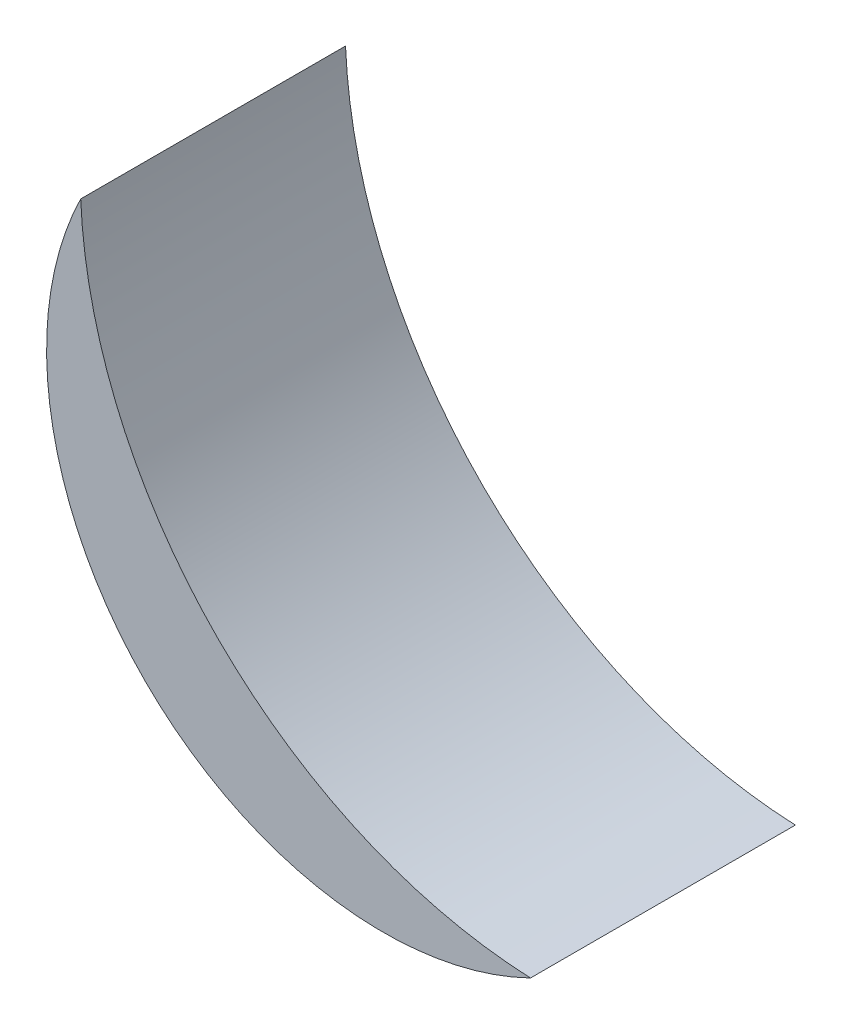
ISO-10303-21;
HEADER;
FILE_DESCRIPTION(('STEP AP214'),'2;1');
FILE_NAME('part.step','',(''),(''),'','','');
FILE_SCHEMA(('AUTOMOTIVE_DESIGN { 1 0 10303 214 1 1 1 1 }'));
ENDSEC;
DATA;
#1=APPLICATION_CONTEXT('core data for automotive mechanical design processes');
#2=APPLICATION_PROTOCOL_DEFINITION('international standard','automotive_design',2000,#1);
#3=PRODUCT_CONTEXT('',#1,'mechanical');
#4=PRODUCT('Part','Part','',(#3));
#5=PRODUCT_RELATED_PRODUCT_CATEGORY('part','',(#4));
#6=PRODUCT_DEFINITION_FORMATION('','',#4);
#7=PRODUCT_DEFINITION_CONTEXT('part definition',#1,'design');
#8=PRODUCT_DEFINITION('design','',#6,#7);
#9=PRODUCT_DEFINITION_SHAPE('','',#8);
#10=(LENGTH_UNIT() NAMED_UNIT(*) SI_UNIT(.MILLI.,.METRE.));
#11=(NAMED_UNIT(*) PLANE_ANGLE_UNIT() SI_UNIT($,.RADIAN.));
#12=(NAMED_UNIT(*) SI_UNIT($,.STERADIAN.) SOLID_ANGLE_UNIT());
#13=UNCERTAINTY_MEASURE_WITH_UNIT(LENGTH_MEASURE(1.E-05),#10,'distance_accuracy_value','');
#14=(GEOMETRIC_REPRESENTATION_CONTEXT(3) GLOBAL_UNCERTAINTY_ASSIGNED_CONTEXT((#13)) GLOBAL_UNIT_ASSIGNED_CONTEXT((#10,
#11,#12)) REPRESENTATION_CONTEXT('',''));
#15=CARTESIAN_POINT('',(0.,0.,0.));
#16=DIRECTION('',(0.,0.,1.));
#17=DIRECTION('',(1.,0.,0.));
#18=AXIS2_PLACEMENT_3D('',#15,#16,#17);
#19=CARTESIAN_POINT('',(136.398,111.633,0.));
#20=DIRECTION('',(0.,0.,-1.));
#21=DIRECTION('',(1.,0.,0.));
#22=AXIS2_PLACEMENT_3D('',#19,#20,#21);
#23=CYLINDRICAL_SURFACE('',#22,0.3556);
#24=DIRECTION('',(0.,0.,1.));
#25=VECTOR('',#24,1.);
#26=CARTESIAN_POINT('',(136.042741649054,111.617415902869,0.));
#27=LINE('',#26,#25);
#28=CARTESIAN_POINT('',(136.042741649054,111.617415902869,0.));
#29=VERTEX_POINT('',#28);
#30=CARTESIAN_POINT('',(136.042741649054,111.617415902869,0.1999996));
#31=VERTEX_POINT('',#30);
#32=EDGE_CURVE('E11',#29,#31,#27,.T.);
#33=ORIENTED_EDGE('',*,*,#32,.T.);
#34=CARTESIAN_POINT('',(136.398,111.633,0.1999996));
#35=DIRECTION('',(0.,0.,1.));
#36=DIRECTION('',(1.,0.,0.));
#37=AXIS2_PLACEMENT_3D('',#34,#35,#36);
#38=CIRCLE('',#37,0.3556);
#39=CARTESIAN_POINT('',(136.382415902869,111.277741649054,0.1999996));
#40=VERTEX_POINT('',#39);
#41=EDGE_CURVE('E24',#31,#40,#38,.T.);
#42=ORIENTED_EDGE('',*,*,#41,.T.);
#43=DIRECTION('',(0.,0.,1.));
#44=VECTOR('',#43,1.);
#45=CARTESIAN_POINT('',(136.382415902869,111.277741649054,0.));
#46=LINE('',#45,#44);
#47=CARTESIAN_POINT('',(136.382415902869,111.277741649054,0.));
#48=VERTEX_POINT('',#47);
#49=EDGE_CURVE('E40',#48,#40,#46,.T.);
#50=ORIENTED_EDGE('',*,*,#49,.F.);
#51=CARTESIAN_POINT('',(136.398,111.633,0.));
#52=DIRECTION('',(0.,0.,1.));
#53=DIRECTION('',(1.,0.,0.));
#54=AXIS2_PLACEMENT_3D('',#51,#52,#53);
#55=CIRCLE('',#54,0.3556);
#56=EDGE_CURVE('E42',#29,#48,#55,.T.);
#57=ORIENTED_EDGE('',*,*,#56,.F.);
#58=EDGE_LOOP('',(#33,#42,#50,#57));
#59=FACE_BOUND('',#58,.T.);
#60=ADVANCED_FACE('F17',(#59),#23,.F.);
#61=CARTESIAN_POINT('',(136.27100127,111.50600127,0.));
#62=DIRECTION('',(0.,0.,-1.));
#63=DIRECTION('',(-0.707106781186548,0.707106781186548,0.));
#64=AXIS2_PLACEMENT_3D('',#61,#62,#63);
#65=CYLINDRICAL_SURFACE('',#64,0.253999360179542);
#66=CARTESIAN_POINT('',(136.27100127,111.50600127,0.1999996));
#67=DIRECTION('',(0.,0.,1.));
#68=DIRECTION('',(-0.707106781186548,0.707106781186548,0.));
#69=AXIS2_PLACEMENT_3D('',#66,#67,#68);
#70=CIRCLE('',#69,0.253999360179542);
#71=EDGE_CURVE('E49',#31,#40,#70,.T.);
#72=ORIENTED_EDGE('',*,*,#71,.F.);
#73=ORIENTED_EDGE('',*,*,#32,.F.);
#74=CARTESIAN_POINT('',(136.27100127,111.50600127,0.));
#75=DIRECTION('',(0.,0.,1.));
#76=DIRECTION('',(-0.707106781186548,0.707106781186548,0.));
#77=AXIS2_PLACEMENT_3D('',#74,#75,#76);
#78=CIRCLE('',#77,0.253999360179542);
#79=EDGE_CURVE('E48',#29,#48,#78,.T.);
#80=ORIENTED_EDGE('',*,*,#79,.T.);
#81=ORIENTED_EDGE('',*,*,#49,.T.);
#82=EDGE_LOOP('',(#72,#73,#80,#81));
#83=FACE_BOUND('',#82,.T.);
#84=ADVANCED_FACE('F51',(#83),#65,.T.);
#85=CARTESIAN_POINT('',(136.45060594,111.3263966,0.));
#86=DIRECTION('',(0.,0.,-1.));
#87=DIRECTION('',(-1.,0.,0.));
#88=AXIS2_PLACEMENT_3D('',#85,#86,#87);
#89=PLANE('',#88);
#90=ORIENTED_EDGE('',*,*,#56,.T.);
#91=ORIENTED_EDGE('',*,*,#79,.F.);
#92=EDGE_LOOP('',(#90,#91));
#93=FACE_BOUND('',#92,.T.);
#94=ADVANCED_FACE('F47',(#93),#89,.T.);
#95=CARTESIAN_POINT('',(136.45060594,111.3263966,0.1999996));
#96=DIRECTION('',(0.,0.,-1.));
#97=DIRECTION('',(-1.,0.,0.));
#98=AXIS2_PLACEMENT_3D('',#95,#96,#97);
#99=PLANE('',#98);
#100=ORIENTED_EDGE('',*,*,#71,.T.);
#101=ORIENTED_EDGE('',*,*,#41,.F.);
#102=EDGE_LOOP('',(#100,#101));
#103=FACE_BOUND('',#102,.T.);
#104=ADVANCED_FACE('F55',(#103),#99,.F.);
#105=CLOSED_SHELL('',(#60,#84,#94,#104));
#106=MANIFOLD_SOLID_BREP('B1',#105);
#107=ADVANCED_BREP_SHAPE_REPRESENTATION('',(#18,#106),#14);
#108=SHAPE_DEFINITION_REPRESENTATION(#9,#107);
ENDSEC;
END-ISO-10303-21;
